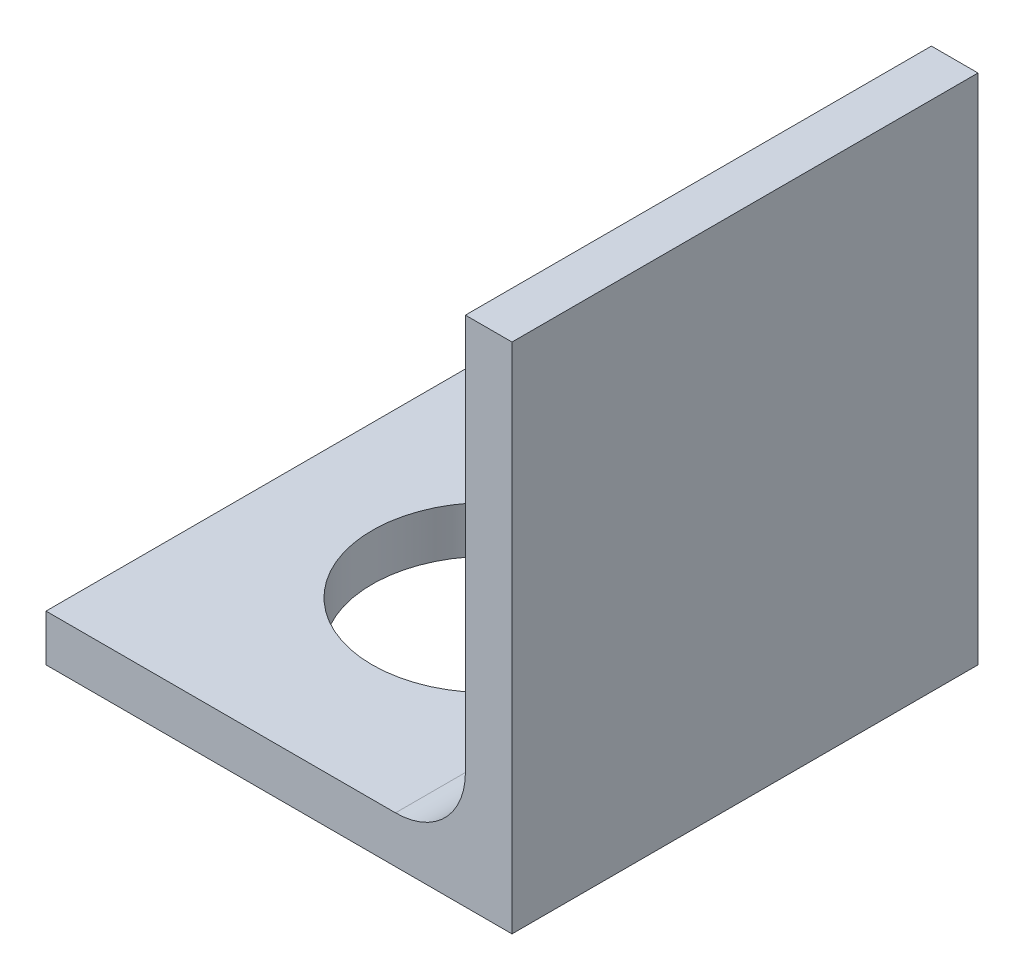
ISO-10303-21;
HEADER;
FILE_DESCRIPTION(('STEP AP214'),'2;1');
FILE_NAME('part.step','',(''),(''),'','','');
FILE_SCHEMA(('AUTOMOTIVE_DESIGN { 1 0 10303 214 1 1 1 1 }'));
ENDSEC;
DATA;
#1=APPLICATION_CONTEXT('core data for automotive mechanical design processes');
#2=APPLICATION_PROTOCOL_DEFINITION('international standard','automotive_design',2000,#1);
#3=PRODUCT_CONTEXT('',#1,'mechanical');
#4=PRODUCT('Part','Part','',(#3));
#5=PRODUCT_RELATED_PRODUCT_CATEGORY('part','',(#4));
#6=PRODUCT_DEFINITION_FORMATION('','',#4);
#7=PRODUCT_DEFINITION_CONTEXT('part definition',#1,'design');
#8=PRODUCT_DEFINITION('design','',#6,#7);
#9=PRODUCT_DEFINITION_SHAPE('','',#8);
#10=(LENGTH_UNIT() NAMED_UNIT(*) SI_UNIT(.MILLI.,.METRE.));
#11=(NAMED_UNIT(*) PLANE_ANGLE_UNIT() SI_UNIT($,.RADIAN.));
#12=(NAMED_UNIT(*) SI_UNIT($,.STERADIAN.) SOLID_ANGLE_UNIT());
#13=UNCERTAINTY_MEASURE_WITH_UNIT(LENGTH_MEASURE(1.E-05),#10,'distance_accuracy_value','');
#14=(GEOMETRIC_REPRESENTATION_CONTEXT(3) GLOBAL_UNCERTAINTY_ASSIGNED_CONTEXT((#13)) GLOBAL_UNIT_ASSIGNED_CONTEXT((#10,
#11,#12)) REPRESENTATION_CONTEXT('',''));
#15=CARTESIAN_POINT('',(0.,0.,0.));
#16=DIRECTION('',(0.,0.,1.));
#17=DIRECTION('',(1.,0.,0.));
#18=AXIS2_PLACEMENT_3D('',#15,#16,#17);
#19=CARTESIAN_POINT('',(0.,0.,20.));
#20=DIRECTION('',(0.,-1.,0.));
#21=DIRECTION('',(0.,0.,-1.));
#22=AXIS2_PLACEMENT_3D('',#19,#20,#21);
#23=PLANE('',#22);
#24=CARTESIAN_POINT('',(9.,0.,10.));
#25=DIRECTION('',(0.,1.,0.));
#26=DIRECTION('',(0.,0.,1.));
#27=AXIS2_PLACEMENT_3D('',#24,#25,#26);
#28=CIRCLE('',#27,5.);
#29=CARTESIAN_POINT('',(9.,0.,15.));
#30=VERTEX_POINT('',#29);
#31=EDGE_CURVE('E140',#30,#30,#28,.T.);
#32=ORIENTED_EDGE('',*,*,#31,.F.);
#33=EDGE_LOOP('',(#32));
#34=FACE_BOUND('',#33,.T.);
#35=DIRECTION('',(-1.,0.,0.));
#36=VECTOR('',#35,1.);
#37=CARTESIAN_POINT('',(0.,0.,20.));
#38=LINE('',#37,#36);
#39=CARTESIAN_POINT('',(15.,0.,20.));
#40=VERTEX_POINT('',#39);
#41=CARTESIAN_POINT('',(0.,0.,20.));
#42=VERTEX_POINT('',#41);
#43=EDGE_CURVE('E161',#40,#42,#38,.T.);
#44=ORIENTED_EDGE('',*,*,#43,.F.);
#45=DIRECTION('',(0.,0.,1.));
#46=VECTOR('',#45,1.);
#47=CARTESIAN_POINT('',(15.,0.,0.));
#48=LINE('',#47,#46);
#49=CARTESIAN_POINT('',(15.,0.,0.));
#50=VERTEX_POINT('',#49);
#51=EDGE_CURVE('E70',#40,#50,#48,.F.);
#52=ORIENTED_EDGE('',*,*,#51,.T.);
#53=DIRECTION('',(-1.,0.,0.));
#54=VECTOR('',#53,1.);
#55=CARTESIAN_POINT('',(0.,0.,0.));
#56=LINE('',#55,#54);
#57=CARTESIAN_POINT('',(0.,0.,0.));
#58=VERTEX_POINT('',#57);
#59=EDGE_CURVE('E111',#50,#58,#56,.T.);
#60=ORIENTED_EDGE('',*,*,#59,.T.);
#61=DIRECTION('',(0.,0.,-1.));
#62=VECTOR('',#61,1.);
#63=CARTESIAN_POINT('',(0.,0.,20.));
#64=LINE('',#63,#62);
#65=EDGE_CURVE('E163',#42,#58,#64,.T.);
#66=ORIENTED_EDGE('',*,*,#65,.F.);
#67=EDGE_LOOP('',(#44,#52,#60,#66));
#68=FACE_BOUND('',#67,.T.);
#69=ADVANCED_FACE('F44',(#34,#68),#23,.F.);
#70=CARTESIAN_POINT('',(0.,0.,20.));
#71=DIRECTION('',(1.,0.,0.));
#72=DIRECTION('',(0.,0.,-1.));
#73=AXIS2_PLACEMENT_3D('',#70,#71,#72);
#74=PLANE('',#73);
#75=DIRECTION('',(0.,-1.,0.));
#76=VECTOR('',#75,1.);
#77=CARTESIAN_POINT('',(0.,0.,0.));
#78=LINE('',#77,#76);
#79=CARTESIAN_POINT('',(0.,-2.,0.));
#80=VERTEX_POINT('',#79);
#81=EDGE_CURVE('E147',#58,#80,#78,.T.);
#82=ORIENTED_EDGE('',*,*,#81,.T.);
#83=DIRECTION('',(0.,0.,-1.));
#84=VECTOR('',#83,1.);
#85=CARTESIAN_POINT('',(0.,-2.,20.));
#86=LINE('',#85,#84);
#87=CARTESIAN_POINT('',(0.,-2.,20.));
#88=VERTEX_POINT('',#87);
#89=EDGE_CURVE('E180',#88,#80,#86,.T.);
#90=ORIENTED_EDGE('',*,*,#89,.F.);
#91=DIRECTION('',(0.,-1.,0.));
#92=VECTOR('',#91,1.);
#93=CARTESIAN_POINT('',(0.,0.,20.));
#94=LINE('',#93,#92);
#95=EDGE_CURVE('E151',#42,#88,#94,.T.);
#96=ORIENTED_EDGE('',*,*,#95,.F.);
#97=ORIENTED_EDGE('',*,*,#65,.T.);
#98=EDGE_LOOP('',(#82,#90,#96,#97));
#99=FACE_BOUND('',#98,.T.);
#100=ADVANCED_FACE('F200',(#99),#74,.F.);
#101=CARTESIAN_POINT('',(0.,-2.,20.));
#102=DIRECTION('',(0.,1.,0.));
#103=DIRECTION('',(0.,0.,1.));
#104=AXIS2_PLACEMENT_3D('',#101,#102,#103);
#105=PLANE('',#104);
#106=CARTESIAN_POINT('',(9.,-2.,10.));
#107=DIRECTION('',(0.,1.,0.));
#108=DIRECTION('',(0.,0.,1.));
#109=AXIS2_PLACEMENT_3D('',#106,#107,#108);
#110=CIRCLE('',#109,5.);
#111=CARTESIAN_POINT('',(9.,-2.,15.));
#112=VERTEX_POINT('',#111);
#113=EDGE_CURVE('E132',#112,#112,#110,.T.);
#114=ORIENTED_EDGE('',*,*,#113,.T.);
#115=EDGE_LOOP('',(#114));
#116=FACE_BOUND('',#115,.T.);
#117=DIRECTION('',(1.,0.,0.));
#118=VECTOR('',#117,1.);
#119=CARTESIAN_POINT('',(0.,-2.,0.));
#120=LINE('',#119,#118);
#121=CARTESIAN_POINT('',(20.,-2.,0.));
#122=VERTEX_POINT('',#121);
#123=EDGE_CURVE('E113',#80,#122,#120,.T.);
#124=ORIENTED_EDGE('',*,*,#123,.T.);
#125=DIRECTION('',(0.,0.,-1.));
#126=VECTOR('',#125,1.);
#127=CARTESIAN_POINT('',(20.,-2.,20.));
#128=LINE('',#127,#126);
#129=CARTESIAN_POINT('',(20.,-2.,20.));
#130=VERTEX_POINT('',#129);
#131=EDGE_CURVE('E112',#130,#122,#128,.T.);
#132=ORIENTED_EDGE('',*,*,#131,.F.);
#133=DIRECTION('',(1.,0.,0.));
#134=VECTOR('',#133,1.);
#135=CARTESIAN_POINT('',(0.,-2.,20.));
#136=LINE('',#135,#134);
#137=EDGE_CURVE('E154',#88,#130,#136,.T.);
#138=ORIENTED_EDGE('',*,*,#137,.F.);
#139=ORIENTED_EDGE('',*,*,#89,.T.);
#140=EDGE_LOOP('',(#124,#132,#138,#139));
#141=FACE_BOUND('',#140,.T.);
#142=ADVANCED_FACE('F197',(#116,#141),#105,.F.);
#143=CARTESIAN_POINT('',(20.,0.,20.));
#144=DIRECTION('',(-1.,0.,0.));
#145=DIRECTION('',(0.,0.,1.));
#146=AXIS2_PLACEMENT_3D('',#143,#144,#145);
#147=PLANE('',#146);
#148=DIRECTION('',(0.,1.,0.));
#149=VECTOR('',#148,1.);
#150=CARTESIAN_POINT('',(20.,0.,0.));
#151=LINE('',#150,#149);
#152=CARTESIAN_POINT('',(20.,20.,0.));
#153=VERTEX_POINT('',#152);
#154=EDGE_CURVE('E102',#122,#153,#151,.T.);
#155=ORIENTED_EDGE('',*,*,#154,.T.);
#156=DIRECTION('',(0.,0.,-1.));
#157=VECTOR('',#156,1.);
#158=CARTESIAN_POINT('',(20.,20.,0.));
#159=LINE('',#158,#157);
#160=CARTESIAN_POINT('',(20.,20.,20.));
#161=VERTEX_POINT('',#160);
#162=EDGE_CURVE('E108',#161,#153,#159,.T.);
#163=ORIENTED_EDGE('',*,*,#162,.F.);
#164=DIRECTION('',(0.,1.,0.));
#165=VECTOR('',#164,1.);
#166=CARTESIAN_POINT('',(20.,0.,20.));
#167=LINE('',#166,#165);
#168=EDGE_CURVE('E158',#130,#161,#167,.T.);
#169=ORIENTED_EDGE('',*,*,#168,.F.);
#170=ORIENTED_EDGE('',*,*,#131,.T.);
#171=EDGE_LOOP('',(#155,#163,#169,#170));
#172=FACE_BOUND('',#171,.T.);
#173=ADVANCED_FACE('F106',(#172),#147,.F.);
#174=CARTESIAN_POINT('',(0.,0.,20.));
#175=DIRECTION('',(0.,0.,1.));
#176=DIRECTION('',(1.,0.,0.));
#177=AXIS2_PLACEMENT_3D('',#174,#175,#176);
#178=PLANE('',#177);
#179=ORIENTED_EDGE('',*,*,#95,.T.);
#180=ORIENTED_EDGE('',*,*,#137,.T.);
#181=ORIENTED_EDGE('',*,*,#168,.T.);
#182=DIRECTION('',(1.,0.,0.));
#183=VECTOR('',#182,1.);
#184=CARTESIAN_POINT('',(20.,20.,20.));
#185=LINE('',#184,#183);
#186=CARTESIAN_POINT('',(18.,20.,20.));
#187=VERTEX_POINT('',#186);
#188=EDGE_CURVE('E131',#187,#161,#185,.T.);
#189=ORIENTED_EDGE('',*,*,#188,.F.);
#190=DIRECTION('',(0.,-1.,0.));
#191=VECTOR('',#190,1.);
#192=CARTESIAN_POINT('',(18.,20.,20.));
#193=LINE('',#192,#191);
#194=CARTESIAN_POINT('',(18.,3.,20.));
#195=VERTEX_POINT('',#194);
#196=EDGE_CURVE('E144',#187,#195,#193,.T.);
#197=ORIENTED_EDGE('',*,*,#196,.T.);
#198=CARTESIAN_POINT('',(15.,3.,20.));
#199=DIRECTION('',(0.,0.,1.));
#200=DIRECTION('',(1.,0.,0.));
#201=AXIS2_PLACEMENT_3D('',#198,#199,#200);
#202=CIRCLE('',#201,3.);
#203=EDGE_CURVE('E53',#195,#40,#202,.F.);
#204=ORIENTED_EDGE('',*,*,#203,.T.);
#205=ORIENTED_EDGE('',*,*,#43,.T.);
#206=EDGE_LOOP('',(#179,#180,#181,#189,#197,#204,#205));
#207=FACE_BOUND('',#206,.T.);
#208=ADVANCED_FACE('F191',(#207),#178,.T.);
#209=CARTESIAN_POINT('',(0.,0.,0.));
#210=DIRECTION('',(0.,0.,1.));
#211=DIRECTION('',(1.,0.,0.));
#212=AXIS2_PLACEMENT_3D('',#209,#210,#211);
#213=PLANE('',#212);
#214=ORIENTED_EDGE('',*,*,#81,.F.);
#215=ORIENTED_EDGE('',*,*,#59,.F.);
#216=CARTESIAN_POINT('',(15.,3.,0.));
#217=DIRECTION('',(0.,0.,1.));
#218=DIRECTION('',(1.,0.,0.));
#219=AXIS2_PLACEMENT_3D('',#216,#217,#218);
#220=CIRCLE('',#219,3.);
#221=CARTESIAN_POINT('',(18.,3.,0.));
#222=VERTEX_POINT('',#221);
#223=EDGE_CURVE('E11',#50,#222,#220,.T.);
#224=ORIENTED_EDGE('',*,*,#223,.T.);
#225=DIRECTION('',(0.,-1.,0.));
#226=VECTOR('',#225,1.);
#227=CARTESIAN_POINT('',(18.,20.,0.));
#228=LINE('',#227,#226);
#229=CARTESIAN_POINT('',(18.,20.,0.));
#230=VERTEX_POINT('',#229);
#231=EDGE_CURVE('E125',#230,#222,#228,.T.);
#232=ORIENTED_EDGE('',*,*,#231,.F.);
#233=DIRECTION('',(-1.,0.,0.));
#234=VECTOR('',#233,1.);
#235=CARTESIAN_POINT('',(20.,20.,0.));
#236=LINE('',#235,#234);
#237=EDGE_CURVE('E117',#153,#230,#236,.T.);
#238=ORIENTED_EDGE('',*,*,#237,.F.);
#239=ORIENTED_EDGE('',*,*,#154,.F.);
#240=ORIENTED_EDGE('',*,*,#123,.F.);
#241=EDGE_LOOP('',(#214,#215,#224,#232,#238,#239,#240));
#242=FACE_BOUND('',#241,.T.);
#243=ADVANCED_FACE('F119',(#242),#213,.F.);
#244=CARTESIAN_POINT('',(18.,20.,0.));
#245=DIRECTION('',(1.,0.,0.));
#246=DIRECTION('',(0.,0.,-1.));
#247=AXIS2_PLACEMENT_3D('',#244,#245,#246);
#248=PLANE('',#247);
#249=ORIENTED_EDGE('',*,*,#231,.T.);
#250=DIRECTION('',(0.,0.,1.));
#251=VECTOR('',#250,1.);
#252=CARTESIAN_POINT('',(18.,3.,20.));
#253=LINE('',#252,#251);
#254=EDGE_CURVE('E177',#222,#195,#253,.T.);
#255=ORIENTED_EDGE('',*,*,#254,.T.);
#256=ORIENTED_EDGE('',*,*,#196,.F.);
#257=DIRECTION('',(0.,0.,1.));
#258=VECTOR('',#257,1.);
#259=CARTESIAN_POINT('',(18.,20.,0.));
#260=LINE('',#259,#258);
#261=EDGE_CURVE('E127',#230,#187,#260,.T.);
#262=ORIENTED_EDGE('',*,*,#261,.F.);
#263=EDGE_LOOP('',(#249,#255,#256,#262));
#264=FACE_BOUND('',#263,.T.);
#265=ADVANCED_FACE('F189',(#264),#248,.F.);
#266=CARTESIAN_POINT('',(0.,20.,0.));
#267=DIRECTION('',(0.,-1.,0.));
#268=DIRECTION('',(0.,0.,-1.));
#269=AXIS2_PLACEMENT_3D('',#266,#267,#268);
#270=PLANE('',#269);
#271=ORIENTED_EDGE('',*,*,#162,.T.);
#272=ORIENTED_EDGE('',*,*,#237,.T.);
#273=ORIENTED_EDGE('',*,*,#261,.T.);
#274=ORIENTED_EDGE('',*,*,#188,.T.);
#275=EDGE_LOOP('',(#271,#272,#273,#274));
#276=FACE_BOUND('',#275,.T.);
#277=ADVANCED_FACE('F129',(#276),#270,.F.);
#278=CARTESIAN_POINT('',(9.,-30.,10.));
#279=DIRECTION('',(0.,1.,0.));
#280=DIRECTION('',(0.,0.,1.));
#281=AXIS2_PLACEMENT_3D('',#278,#279,#280);
#282=CYLINDRICAL_SURFACE('',#281,5.);
#283=ORIENTED_EDGE('',*,*,#31,.T.);
#284=EDGE_LOOP('',(#283));
#285=FACE_BOUND('',#284,.T.);
#286=ORIENTED_EDGE('',*,*,#113,.F.);
#287=EDGE_LOOP('',(#286));
#288=FACE_BOUND('',#287,.T.);
#289=ADVANCED_FACE('F205',(#285,#288),#282,.F.);
#290=CARTESIAN_POINT('',(15.,3.,0.));
#291=DIRECTION('',(0.,0.,-1.));
#292=DIRECTION('',(-1.,0.,0.));
#293=AXIS2_PLACEMENT_3D('',#290,#291,#292);
#294=CYLINDRICAL_SURFACE('',#293,3.);
#295=ORIENTED_EDGE('',*,*,#223,.F.);
#296=ORIENTED_EDGE('',*,*,#51,.F.);
#297=ORIENTED_EDGE('',*,*,#203,.F.);
#298=ORIENTED_EDGE('',*,*,#254,.F.);
#299=EDGE_LOOP('',(#295,#296,#297,#298));
#300=FACE_BOUND('',#299,.T.);
#301=ADVANCED_FACE('F50',(#300),#294,.F.);
#302=CLOSED_SHELL('',(#69,#100,#142,#173,#208,#243,#265,#277,#289,#301));
#303=MANIFOLD_SOLID_BREP('B2',#302);
#304=ADVANCED_BREP_SHAPE_REPRESENTATION('',(#18,#303),#14);
#305=SHAPE_DEFINITION_REPRESENTATION(#9,#304);
ENDSEC;
END-ISO-10303-21;
